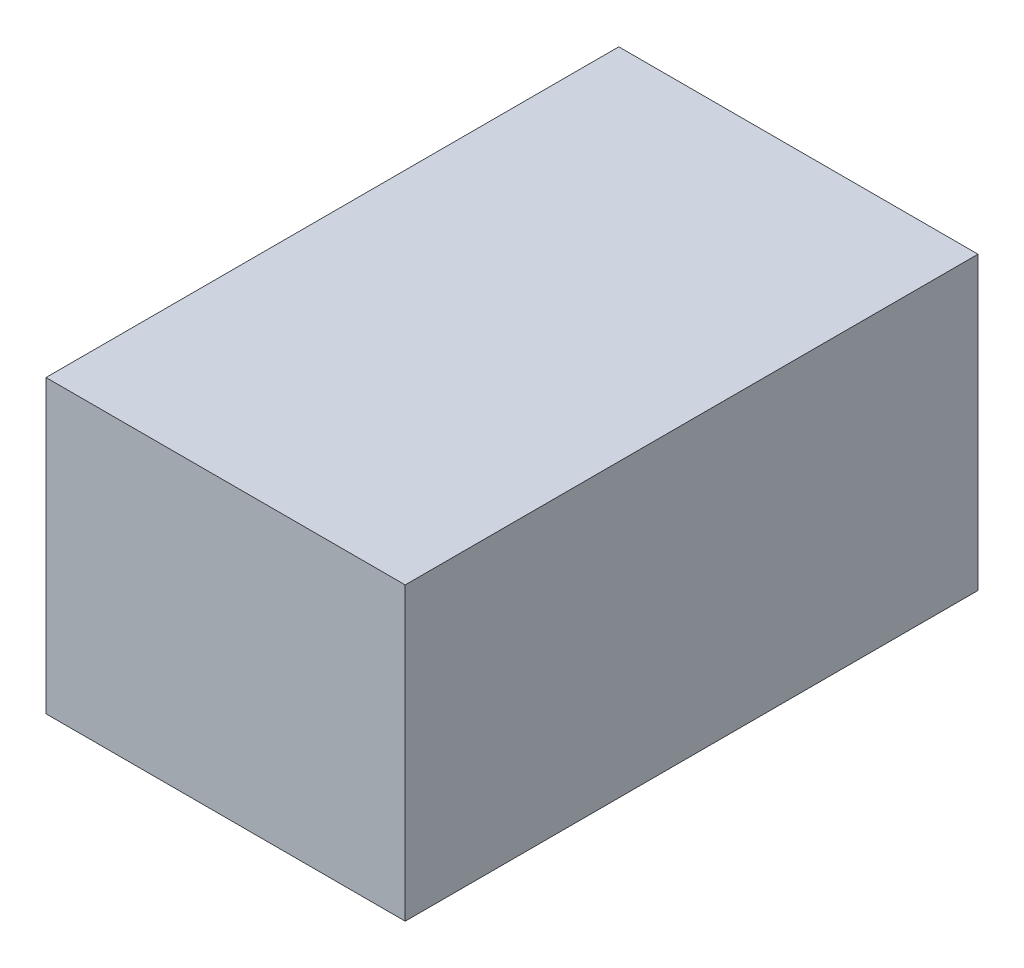
ISO-10303-21;
HEADER;
FILE_DESCRIPTION(('STEP AP214'),'2;1');
FILE_NAME('part.step','',(''),(''),'','','');
FILE_SCHEMA(('AUTOMOTIVE_DESIGN { 1 0 10303 214 1 1 1 1 }'));
ENDSEC;
DATA;
#1=APPLICATION_CONTEXT('core data for automotive mechanical design processes');
#2=APPLICATION_PROTOCOL_DEFINITION('international standard','automotive_design',2000,#1);
#3=PRODUCT_CONTEXT('',#1,'mechanical');
#4=PRODUCT('Part','Part','',(#3));
#5=PRODUCT_RELATED_PRODUCT_CATEGORY('part','',(#4));
#6=PRODUCT_DEFINITION_FORMATION('','',#4);
#7=PRODUCT_DEFINITION_CONTEXT('part definition',#1,'design');
#8=PRODUCT_DEFINITION('design','',#6,#7);
#9=PRODUCT_DEFINITION_SHAPE('','',#8);
#10=(LENGTH_UNIT() NAMED_UNIT(*) SI_UNIT(.MILLI.,.METRE.));
#11=(NAMED_UNIT(*) PLANE_ANGLE_UNIT() SI_UNIT($,.RADIAN.));
#12=(NAMED_UNIT(*) SI_UNIT($,.STERADIAN.) SOLID_ANGLE_UNIT());
#13=UNCERTAINTY_MEASURE_WITH_UNIT(LENGTH_MEASURE(1.E-05),#10,'distance_accuracy_value','');
#14=(GEOMETRIC_REPRESENTATION_CONTEXT(3) GLOBAL_UNCERTAINTY_ASSIGNED_CONTEXT((#13)) GLOBAL_UNIT_ASSIGNED_CONTEXT((#10,
#11,#12)) REPRESENTATION_CONTEXT('',''));
#15=CARTESIAN_POINT('',(0.,0.,0.));
#16=DIRECTION('',(0.,0.,1.));
#17=DIRECTION('',(1.,0.,0.));
#18=AXIS2_PLACEMENT_3D('',#15,#16,#17);
#19=CARTESIAN_POINT('',(0.800000000000102,-32.665102826636,-45.466));
#20=DIRECTION('',(0.,-1.,0.));
#21=DIRECTION('',(0.,0.,-1.));
#22=AXIS2_PLACEMENT_3D('',#19,#20,#21);
#23=PLANE('',#22);
#24=DIRECTION('',(1.,0.,0.));
#25=VECTOR('',#24,1.);
#26=CARTESIAN_POINT('',(0.800000000000102,-32.665102826636,-45.466));
#27=LINE('',#26,#25);
#28=CARTESIAN_POINT('',(0.800000000000102,-32.665102826636,-45.466));
#29=VERTEX_POINT('',#28);
#30=CARTESIAN_POINT('',(10.1979999999993,-32.665102826636,-45.466));
#31=VERTEX_POINT('',#30);
#32=EDGE_CURVE('E20',#29,#31,#27,.T.);
#33=ORIENTED_EDGE('',*,*,#32,.F.);
#34=DIRECTION('',(0.,0.,-1.));
#35=VECTOR('',#34,1.);
#36=CARTESIAN_POINT('',(0.800000000000102,-32.665102826636,-63.5));
#37=LINE('',#36,#35);
#38=CARTESIAN_POINT('',(0.800000000000102,-32.665102826636,-60.452));
#39=VERTEX_POINT('',#38);
#40=EDGE_CURVE('E80',#29,#39,#37,.T.);
#41=ORIENTED_EDGE('',*,*,#40,.T.);
#42=DIRECTION('',(-1.,0.,0.));
#43=VECTOR('',#42,1.);
#44=CARTESIAN_POINT('',(0.800000000000102,-32.665102826636,-60.452));
#45=LINE('',#44,#43);
#46=CARTESIAN_POINT('',(10.1979999999993,-32.665102826636,-60.452));
#47=VERTEX_POINT('',#46);
#48=EDGE_CURVE('E68',#47,#39,#45,.T.);
#49=ORIENTED_EDGE('',*,*,#48,.F.);
#50=DIRECTION('',(0.,0.,-1.));
#51=VECTOR('',#50,1.);
#52=CARTESIAN_POINT('',(10.1979999999993,-32.665102826636,-63.5));
#53=LINE('',#52,#51);
#54=EDGE_CURVE('E56',#31,#47,#53,.T.);
#55=ORIENTED_EDGE('',*,*,#54,.F.);
#56=EDGE_LOOP('',(#33,#41,#49,#55));
#57=FACE_BOUND('',#56,.T.);
#58=ADVANCED_FACE('F17',(#57),#23,.T.);
#59=CARTESIAN_POINT('',(0.800000000000102,-25.0451028266335,-45.466));
#60=DIRECTION('',(0.,0.,1.));
#61=DIRECTION('',(1.,0.,0.));
#62=AXIS2_PLACEMENT_3D('',#59,#60,#61);
#63=PLANE('',#62);
#64=DIRECTION('',(1.,0.,0.));
#65=VECTOR('',#64,1.);
#66=CARTESIAN_POINT('',(0.800000000000102,-25.0451028266335,-45.466));
#67=LINE('',#66,#65);
#68=CARTESIAN_POINT('',(0.800000000000102,-25.0451028266335,-45.466));
#69=VERTEX_POINT('',#68);
#70=CARTESIAN_POINT('',(10.1979999999993,-25.0451028266335,-45.466));
#71=VERTEX_POINT('',#70);
#72=EDGE_CURVE('E83',#69,#71,#67,.T.);
#73=ORIENTED_EDGE('',*,*,#72,.F.);
#74=DIRECTION('',(0.,1.,0.));
#75=VECTOR('',#74,1.);
#76=CARTESIAN_POINT('',(0.800000000000102,0.,-45.466));
#77=LINE('',#76,#75);
#78=EDGE_CURVE('E65',#69,#29,#77,.F.);
#79=ORIENTED_EDGE('',*,*,#78,.T.);
#80=ORIENTED_EDGE('',*,*,#32,.T.);
#81=DIRECTION('',(0.,1.,0.));
#82=VECTOR('',#81,1.);
#83=CARTESIAN_POINT('',(10.1979999999993,0.,-45.466));
#84=LINE('',#83,#82);
#85=EDGE_CURVE('E62',#71,#31,#84,.F.);
#86=ORIENTED_EDGE('',*,*,#85,.F.);
#87=EDGE_LOOP('',(#73,#79,#80,#86));
#88=FACE_BOUND('',#87,.T.);
#89=ADVANCED_FACE('F61',(#88),#63,.T.);
#90=CARTESIAN_POINT('',(10.1979999999993,0.,-63.5));
#91=DIRECTION('',(1.,0.,0.));
#92=DIRECTION('',(0.,0.,-1.));
#93=AXIS2_PLACEMENT_3D('',#90,#91,#92);
#94=PLANE('',#93);
#95=DIRECTION('',(0.,1.,0.));
#96=VECTOR('',#95,1.);
#97=CARTESIAN_POINT('',(10.1979999999993,-32.665102826636,-60.452));
#98=LINE('',#97,#96);
#99=CARTESIAN_POINT('',(10.1979999999993,-25.0451028266335,-60.452));
#100=VERTEX_POINT('',#99);
#101=EDGE_CURVE('E70',#100,#47,#98,.F.);
#102=ORIENTED_EDGE('',*,*,#101,.F.);
#103=DIRECTION('',(0.,0.,1.));
#104=VECTOR('',#103,1.);
#105=CARTESIAN_POINT('',(10.1979999999993,-25.0451028266335,-60.452));
#106=LINE('',#105,#104);
#107=EDGE_CURVE('E74',#71,#100,#106,.F.);
#108=ORIENTED_EDGE('',*,*,#107,.F.);
#109=ORIENTED_EDGE('',*,*,#85,.T.);
#110=ORIENTED_EDGE('',*,*,#54,.T.);
#111=EDGE_LOOP('',(#102,#108,#109,#110));
#112=FACE_BOUND('',#111,.T.);
#113=ADVANCED_FACE('F72',(#112),#94,.T.);
#114=CARTESIAN_POINT('',(0.800000000000102,-32.665102826636,-60.452));
#115=DIRECTION('',(0.,0.,-1.));
#116=DIRECTION('',(-1.,0.,0.));
#117=AXIS2_PLACEMENT_3D('',#114,#115,#116);
#118=PLANE('',#117);
#119=ORIENTED_EDGE('',*,*,#48,.T.);
#120=DIRECTION('',(0.,1.,0.));
#121=VECTOR('',#120,1.);
#122=CARTESIAN_POINT('',(0.800000000000102,0.,-60.452));
#123=LINE('',#122,#121);
#124=CARTESIAN_POINT('',(0.800000000000102,-25.0451028266335,-60.452));
#125=VERTEX_POINT('',#124);
#126=EDGE_CURVE('E35',#39,#125,#123,.T.);
#127=ORIENTED_EDGE('',*,*,#126,.T.);
#128=DIRECTION('',(1.,0.,0.));
#129=VECTOR('',#128,1.);
#130=CARTESIAN_POINT('',(0.800000000000102,-25.0451028266335,-60.452));
#131=LINE('',#130,#129);
#132=EDGE_CURVE('E26',#100,#125,#131,.F.);
#133=ORIENTED_EDGE('',*,*,#132,.F.);
#134=ORIENTED_EDGE('',*,*,#101,.T.);
#135=EDGE_LOOP('',(#119,#127,#133,#134));
#136=FACE_BOUND('',#135,.T.);
#137=ADVANCED_FACE('F89',(#136),#118,.T.);
#138=CARTESIAN_POINT('',(0.800000000000102,0.,-63.5));
#139=DIRECTION('',(1.,0.,0.));
#140=DIRECTION('',(0.,0.,-1.));
#141=AXIS2_PLACEMENT_3D('',#138,#139,#140);
#142=PLANE('',#141);
#143=ORIENTED_EDGE('',*,*,#40,.F.);
#144=ORIENTED_EDGE('',*,*,#78,.F.);
#145=DIRECTION('',(0.,0.,1.));
#146=VECTOR('',#145,1.);
#147=CARTESIAN_POINT('',(0.800000000000102,-25.0451028266335,-60.452));
#148=LINE('',#147,#146);
#149=EDGE_CURVE('E11',#125,#69,#148,.T.);
#150=ORIENTED_EDGE('',*,*,#149,.F.);
#151=ORIENTED_EDGE('',*,*,#126,.F.);
#152=EDGE_LOOP('',(#143,#144,#150,#151));
#153=FACE_BOUND('',#152,.T.);
#154=ADVANCED_FACE('F91',(#153),#142,.F.);
#155=CARTESIAN_POINT('',(0.800000000000102,-25.0451028266335,-60.452));
#156=DIRECTION('',(0.,1.,0.));
#157=DIRECTION('',(0.,0.,1.));
#158=AXIS2_PLACEMENT_3D('',#155,#156,#157);
#159=PLANE('',#158);
#160=ORIENTED_EDGE('',*,*,#132,.T.);
#161=ORIENTED_EDGE('',*,*,#149,.T.);
#162=ORIENTED_EDGE('',*,*,#72,.T.);
#163=ORIENTED_EDGE('',*,*,#107,.T.);
#164=EDGE_LOOP('',(#160,#161,#162,#163));
#165=FACE_BOUND('',#164,.T.);
#166=ADVANCED_FACE('F88',(#165),#159,.T.);
#167=CLOSED_SHELL('',(#58,#89,#113,#137,#154,#166));
#168=MANIFOLD_SOLID_BREP('B1',#167);
#169=ADVANCED_BREP_SHAPE_REPRESENTATION('',(#18,#168),#14);
#170=SHAPE_DEFINITION_REPRESENTATION(#9,#169);
ENDSEC;
END-ISO-10303-21;
